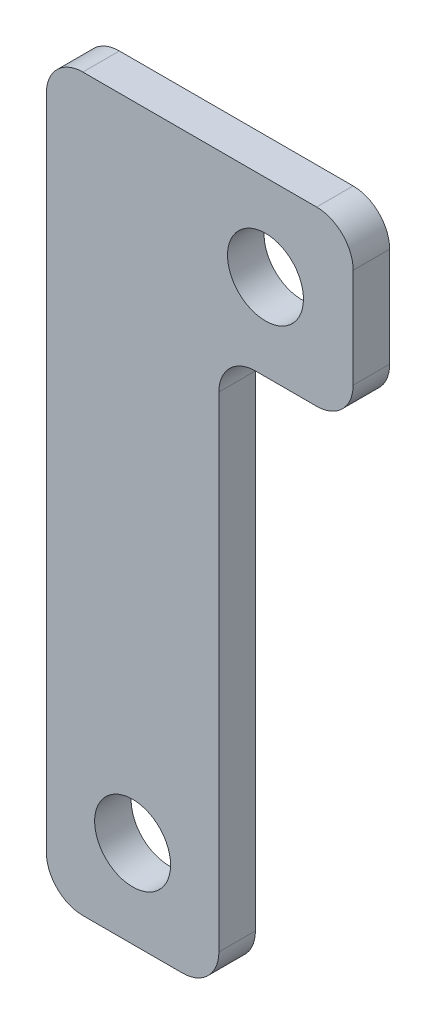
ISO-10303-21;
HEADER;
FILE_DESCRIPTION(('STEP AP214'),'2;1');
FILE_NAME('part.step','',(''),(''),'','','');
FILE_SCHEMA(('AUTOMOTIVE_DESIGN { 1 0 10303 214 1 1 1 1 }'));
ENDSEC;
DATA;
#1=APPLICATION_CONTEXT('core data for automotive mechanical design processes');
#2=APPLICATION_PROTOCOL_DEFINITION('international standard','automotive_design',2000,#1);
#3=PRODUCT_CONTEXT('',#1,'mechanical');
#4=PRODUCT('Part','Part','',(#3));
#5=PRODUCT_RELATED_PRODUCT_CATEGORY('part','',(#4));
#6=PRODUCT_DEFINITION_FORMATION('','',#4);
#7=PRODUCT_DEFINITION_CONTEXT('part definition',#1,'design');
#8=PRODUCT_DEFINITION('design','',#6,#7);
#9=PRODUCT_DEFINITION_SHAPE('','',#8);
#10=(LENGTH_UNIT() NAMED_UNIT(*) SI_UNIT(.MILLI.,.METRE.));
#11=(NAMED_UNIT(*) PLANE_ANGLE_UNIT() SI_UNIT($,.RADIAN.));
#12=(NAMED_UNIT(*) SI_UNIT($,.STERADIAN.) SOLID_ANGLE_UNIT());
#13=UNCERTAINTY_MEASURE_WITH_UNIT(LENGTH_MEASURE(1.E-05),#10,'distance_accuracy_value','');
#14=(GEOMETRIC_REPRESENTATION_CONTEXT(3) GLOBAL_UNCERTAINTY_ASSIGNED_CONTEXT((#13)) GLOBAL_UNIT_ASSIGNED_CONTEXT((#10,
#11,#12)) REPRESENTATION_CONTEXT('',''));
#15=CARTESIAN_POINT('',(0.,0.,0.));
#16=DIRECTION('',(0.,0.,1.));
#17=DIRECTION('',(1.,0.,0.));
#18=AXIS2_PLACEMENT_3D('',#15,#16,#17);
#19=CARTESIAN_POINT('',(-133.395921324416,118.528527902483,3.175));
#20=DIRECTION('',(0.,1.,0.));
#21=DIRECTION('',(0.,0.,1.));
#22=AXIS2_PLACEMENT_3D('',#19,#20,#21);
#23=PLANE('',#22);
#24=DIRECTION('',(1.,0.,0.));
#25=VECTOR('',#24,1.);
#26=CARTESIAN_POINT('',(-145.065921324416,118.528527902483,3.175));
#27=LINE('',#26,#25);
#28=CARTESIAN_POINT('',(-141.890921324416,118.528527902483,3.175));
#29=VERTEX_POINT('',#28);
#30=CARTESIAN_POINT('',(-136.570921324417,118.528527902483,3.175));
#31=VERTEX_POINT('',#30);
#32=EDGE_CURVE('E153',#29,#31,#27,.T.);
#33=ORIENTED_EDGE('',*,*,#32,.F.);
#34=DIRECTION('',(0.,0.,-1.));
#35=VECTOR('',#34,1.);
#36=CARTESIAN_POINT('',(-141.890921324416,118.528527902483,0.));
#37=LINE('',#36,#35);
#38=CARTESIAN_POINT('',(-141.890921324416,118.528527902483,0.));
#39=VERTEX_POINT('',#38);
#40=EDGE_CURVE('E193',#29,#39,#37,.T.);
#41=ORIENTED_EDGE('',*,*,#40,.T.);
#42=DIRECTION('',(1.,0.,0.));
#43=VECTOR('',#42,1.);
#44=CARTESIAN_POINT('',(-133.395921324416,118.528527902483,0.));
#45=LINE('',#44,#43);
#46=CARTESIAN_POINT('',(-136.570921324417,118.528527902483,0.));
#47=VERTEX_POINT('',#46);
#48=EDGE_CURVE('E214',#39,#47,#45,.T.);
#49=ORIENTED_EDGE('',*,*,#48,.T.);
#50=DIRECTION('',(0.,0.,-1.));
#51=VECTOR('',#50,1.);
#52=CARTESIAN_POINT('',(-136.570921324417,118.528527902483,3.175));
#53=LINE('',#52,#51);
#54=EDGE_CURVE('E191',#47,#31,#53,.F.);
#55=ORIENTED_EDGE('',*,*,#54,.T.);
#56=EDGE_LOOP('',(#33,#41,#49,#55));
#57=FACE_BOUND('',#56,.T.);
#58=ADVANCED_FACE('F37',(#57),#23,.F.);
#59=CARTESIAN_POINT('',(-133.395921324416,133.528527902483,3.175));
#60=DIRECTION('',(-1.,0.,0.));
#61=DIRECTION('',(0.,0.,1.));
#62=AXIS2_PLACEMENT_3D('',#59,#60,#61);
#63=PLANE('',#62);
#64=DIRECTION('',(0.,1.,0.));
#65=VECTOR('',#64,1.);
#66=CARTESIAN_POINT('',(-133.395921324416,133.528527902483,3.175));
#67=LINE('',#66,#65);
#68=CARTESIAN_POINT('',(-133.395921324416,121.703527902483,3.175));
#69=VERTEX_POINT('',#68);
#70=CARTESIAN_POINT('',(-133.395921324416,130.353527902483,3.175));
#71=VERTEX_POINT('',#70);
#72=EDGE_CURVE('E157',#69,#71,#67,.T.);
#73=ORIENTED_EDGE('',*,*,#72,.F.);
#74=DIRECTION('',(0.,0.,-1.));
#75=VECTOR('',#74,1.);
#76=CARTESIAN_POINT('',(-133.395921324416,121.703527902483,3.175));
#77=LINE('',#76,#75);
#78=CARTESIAN_POINT('',(-133.395921324416,121.703527902483,0.));
#79=VERTEX_POINT('',#78);
#80=EDGE_CURVE('E198',#69,#79,#77,.T.);
#81=ORIENTED_EDGE('',*,*,#80,.T.);
#82=DIRECTION('',(0.,1.,0.));
#83=VECTOR('',#82,1.);
#84=CARTESIAN_POINT('',(-133.395921324416,133.528527902483,0.));
#85=LINE('',#84,#83);
#86=CARTESIAN_POINT('',(-133.395921324416,130.353527902483,0.));
#87=VERTEX_POINT('',#86);
#88=EDGE_CURVE('E206',#79,#87,#85,.T.);
#89=ORIENTED_EDGE('',*,*,#88,.T.);
#90=DIRECTION('',(0.,0.,-1.));
#91=VECTOR('',#90,1.);
#92=CARTESIAN_POINT('',(-133.395921324416,130.353527902483,3.175));
#93=LINE('',#92,#91);
#94=EDGE_CURVE('E196',#87,#71,#93,.F.);
#95=ORIENTED_EDGE('',*,*,#94,.T.);
#96=EDGE_LOOP('',(#73,#81,#89,#95));
#97=FACE_BOUND('',#96,.T.);
#98=ADVANCED_FACE('F205',(#97),#63,.F.);
#99=CARTESIAN_POINT('',(-141.015921324416,133.528527902483,3.175));
#100=DIRECTION('',(0.,-1.,0.));
#101=DIRECTION('',(0.,0.,-1.));
#102=AXIS2_PLACEMENT_3D('',#99,#100,#101);
#103=PLANE('',#102);
#104=DIRECTION('',(-1.,0.,0.));
#105=VECTOR('',#104,1.);
#106=CARTESIAN_POINT('',(-141.015921324416,133.528527902483,0.));
#107=LINE('',#106,#105);
#108=CARTESIAN_POINT('',(-136.570921324417,133.528527902483,0.));
#109=VERTEX_POINT('',#108);
#110=CARTESIAN_POINT('',(-156.890921324416,133.528527902483,0.));
#111=VERTEX_POINT('',#110);
#112=EDGE_CURVE('E213',#109,#111,#107,.T.);
#113=ORIENTED_EDGE('',*,*,#112,.T.);
#114=DIRECTION('',(0.,0.,-1.));
#115=VECTOR('',#114,1.);
#116=CARTESIAN_POINT('',(-156.890921324416,133.528527902483,3.175));
#117=LINE('',#116,#115);
#118=CARTESIAN_POINT('',(-156.890921324416,133.528527902483,3.175));
#119=VERTEX_POINT('',#118);
#120=EDGE_CURVE('E189',#111,#119,#117,.F.);
#121=ORIENTED_EDGE('',*,*,#120,.T.);
#122=DIRECTION('',(-1.,0.,0.));
#123=VECTOR('',#122,1.);
#124=CARTESIAN_POINT('',(-141.015921324416,133.528527902483,3.175));
#125=LINE('',#124,#123);
#126=CARTESIAN_POINT('',(-136.570921324417,133.528527902483,3.175));
#127=VERTEX_POINT('',#126);
#128=EDGE_CURVE('E236',#127,#119,#125,.T.);
#129=ORIENTED_EDGE('',*,*,#128,.F.);
#130=DIRECTION('',(0.,0.,-1.));
#131=VECTOR('',#130,1.);
#132=CARTESIAN_POINT('',(-136.570921324417,133.528527902483,3.175));
#133=LINE('',#132,#131);
#134=EDGE_CURVE('E186',#127,#109,#133,.T.);
#135=ORIENTED_EDGE('',*,*,#134,.T.);
#136=EDGE_LOOP('',(#113,#121,#129,#135));
#137=FACE_BOUND('',#136,.T.);
#138=ADVANCED_FACE('F279',(#137),#103,.F.);
#139=CARTESIAN_POINT('',(-160.065921324417,133.528527902483,3.175));
#140=DIRECTION('',(1.,0.,0.));
#141=DIRECTION('',(0.,0.,-1.));
#142=AXIS2_PLACEMENT_3D('',#139,#140,#141);
#143=PLANE('',#142);
#144=DIRECTION('',(0.,-1.,0.));
#145=VECTOR('',#144,1.);
#146=CARTESIAN_POINT('',(-160.065921324417,133.528527902483,0.));
#147=LINE('',#146,#145);
#148=CARTESIAN_POINT('',(-160.065921324417,130.353527902483,0.));
#149=VERTEX_POINT('',#148);
#150=CARTESIAN_POINT('',(-160.065921324417,73.2035279024834,0.));
#151=VERTEX_POINT('',#150);
#152=EDGE_CURVE('E159',#149,#151,#147,.T.);
#153=ORIENTED_EDGE('',*,*,#152,.T.);
#154=DIRECTION('',(0.,0.,-1.));
#155=VECTOR('',#154,1.);
#156=CARTESIAN_POINT('',(-160.065921324417,73.2035279024834,3.175));
#157=LINE('',#156,#155);
#158=CARTESIAN_POINT('',(-160.065921324417,73.2035279024834,3.175));
#159=VERTEX_POINT('',#158);
#160=EDGE_CURVE('E52',#151,#159,#157,.F.);
#161=ORIENTED_EDGE('',*,*,#160,.T.);
#162=DIRECTION('',(0.,-1.,0.));
#163=VECTOR('',#162,1.);
#164=CARTESIAN_POINT('',(-160.065921324417,133.528527902483,3.175));
#165=LINE('',#164,#163);
#166=CARTESIAN_POINT('',(-160.065921324417,130.353527902483,3.175));
#167=VERTEX_POINT('',#166);
#168=EDGE_CURVE('E232',#167,#159,#165,.T.);
#169=ORIENTED_EDGE('',*,*,#168,.F.);
#170=DIRECTION('',(0.,0.,-1.));
#171=VECTOR('',#170,1.);
#172=CARTESIAN_POINT('',(-160.065921324417,130.353527902483,3.175));
#173=LINE('',#172,#171);
#174=EDGE_CURVE('E182',#167,#149,#173,.T.);
#175=ORIENTED_EDGE('',*,*,#174,.T.);
#176=EDGE_LOOP('',(#153,#161,#169,#175));
#177=FACE_BOUND('',#176,.T.);
#178=ADVANCED_FACE('F222',(#177),#143,.F.);
#179=CARTESIAN_POINT('',(-160.065921324417,70.0285279024834,3.175));
#180=DIRECTION('',(0.,1.,0.));
#181=DIRECTION('',(0.,0.,1.));
#182=AXIS2_PLACEMENT_3D('',#179,#180,#181);
#183=PLANE('',#182);
#184=DIRECTION('',(1.,0.,0.));
#185=VECTOR('',#184,1.);
#186=CARTESIAN_POINT('',(-160.065921324417,70.0285279024834,0.));
#187=LINE('',#186,#185);
#188=CARTESIAN_POINT('',(-156.890921324416,70.0285279024834,0.));
#189=VERTEX_POINT('',#188);
#190=CARTESIAN_POINT('',(-148.240921324416,70.0285279024834,0.));
#191=VERTEX_POINT('',#190);
#192=EDGE_CURVE('E154',#189,#191,#187,.T.);
#193=ORIENTED_EDGE('',*,*,#192,.T.);
#194=DIRECTION('',(0.,0.,-1.));
#195=VECTOR('',#194,1.);
#196=CARTESIAN_POINT('',(-148.240921324416,70.0285279024834,3.175));
#197=LINE('',#196,#195);
#198=CARTESIAN_POINT('',(-148.240921324416,70.0285279024834,3.175));
#199=VERTEX_POINT('',#198);
#200=EDGE_CURVE('E132',#191,#199,#197,.F.);
#201=ORIENTED_EDGE('',*,*,#200,.T.);
#202=DIRECTION('',(1.,0.,0.));
#203=VECTOR('',#202,1.);
#204=CARTESIAN_POINT('',(-160.065921324417,70.0285279024834,3.175));
#205=LINE('',#204,#203);
#206=CARTESIAN_POINT('',(-156.890921324416,70.0285279024834,3.175));
#207=VERTEX_POINT('',#206);
#208=EDGE_CURVE('E231',#207,#199,#205,.T.);
#209=ORIENTED_EDGE('',*,*,#208,.F.);
#210=DIRECTION('',(0.,0.,-1.));
#211=VECTOR('',#210,1.);
#212=CARTESIAN_POINT('',(-156.890921324416,70.0285279024834,3.175));
#213=LINE('',#212,#211);
#214=EDGE_CURVE('E137',#207,#189,#213,.T.);
#215=ORIENTED_EDGE('',*,*,#214,.T.);
#216=EDGE_LOOP('',(#193,#201,#209,#215));
#217=FACE_BOUND('',#216,.T.);
#218=ADVANCED_FACE('F234',(#217),#183,.F.);
#219=CARTESIAN_POINT('',(-145.065921324416,70.0285279024834,3.175));
#220=DIRECTION('',(-1.,0.,0.));
#221=DIRECTION('',(0.,0.,1.));
#222=AXIS2_PLACEMENT_3D('',#219,#220,#221);
#223=PLANE('',#222);
#224=DIRECTION('',(0.,1.,0.));
#225=VECTOR('',#224,1.);
#226=CARTESIAN_POINT('',(-145.065921324416,70.0285279024834,3.175));
#227=LINE('',#226,#225);
#228=CARTESIAN_POINT('',(-145.065921324416,73.2035279024834,3.175));
#229=VERTEX_POINT('',#228);
#230=CARTESIAN_POINT('',(-145.065921324416,115.353527902483,3.175));
#231=VERTEX_POINT('',#230);
#232=EDGE_CURVE('E147',#229,#231,#227,.T.);
#233=ORIENTED_EDGE('',*,*,#232,.F.);
#234=DIRECTION('',(0.,0.,-1.));
#235=VECTOR('',#234,1.);
#236=CARTESIAN_POINT('',(-145.065921324416,73.2035279024834,3.175));
#237=LINE('',#236,#235);
#238=CARTESIAN_POINT('',(-145.065921324416,73.2035279024834,0.));
#239=VERTEX_POINT('',#238);
#240=EDGE_CURVE('E131',#229,#239,#237,.T.);
#241=ORIENTED_EDGE('',*,*,#240,.T.);
#242=DIRECTION('',(0.,1.,0.));
#243=VECTOR('',#242,1.);
#244=CARTESIAN_POINT('',(-145.065921324416,70.0285279024834,0.));
#245=LINE('',#244,#243);
#246=CARTESIAN_POINT('',(-145.065921324416,115.353527902483,0.));
#247=VERTEX_POINT('',#246);
#248=EDGE_CURVE('E144',#239,#247,#245,.T.);
#249=ORIENTED_EDGE('',*,*,#248,.T.);
#250=DIRECTION('',(0.,0.,-1.));
#251=VECTOR('',#250,1.);
#252=CARTESIAN_POINT('',(-145.065921324416,115.353527902483,3.175));
#253=LINE('',#252,#251);
#254=EDGE_CURVE('E149',#247,#231,#253,.F.);
#255=ORIENTED_EDGE('',*,*,#254,.T.);
#256=EDGE_LOOP('',(#233,#241,#249,#255));
#257=FACE_BOUND('',#256,.T.);
#258=ADVANCED_FACE('F143',(#257),#223,.F.);
#259=CARTESIAN_POINT('',(0.,0.,3.175));
#260=DIRECTION('',(0.,0.,-1.));
#261=DIRECTION('',(-1.,0.,0.));
#262=AXIS2_PLACEMENT_3D('',#259,#260,#261);
#263=PLANE('',#262);
#264=CARTESIAN_POINT('',(-141.015921324415,126.028527902453,3.175));
#265=DIRECTION('',(0.,0.,1.));
#266=DIRECTION('',(1.,0.,0.));
#267=AXIS2_PLACEMENT_3D('',#264,#265,#266);
#268=CIRCLE('',#267,3.3);
#269=CARTESIAN_POINT('',(-137.715921324415,126.028527902453,3.175));
#270=VERTEX_POINT('',#269);
#271=EDGE_CURVE('E249',#270,#270,#268,.T.);
#272=ORIENTED_EDGE('',*,*,#271,.F.);
#273=EDGE_LOOP('',(#272));
#274=FACE_BOUND('',#273,.T.);
#275=CARTESIAN_POINT('',(-152.565921324416,77.6485279024834,3.175));
#276=DIRECTION('',(0.,0.,1.));
#277=DIRECTION('',(1.,0.,0.));
#278=AXIS2_PLACEMENT_3D('',#275,#276,#277);
#279=CIRCLE('',#278,3.3);
#280=CARTESIAN_POINT('',(-149.265921324416,77.6485279024834,3.175));
#281=VERTEX_POINT('',#280);
#282=EDGE_CURVE('E243',#281,#281,#279,.T.);
#283=ORIENTED_EDGE('',*,*,#282,.F.);
#284=EDGE_LOOP('',(#283));
#285=FACE_BOUND('',#284,.T.);
#286=ORIENTED_EDGE('',*,*,#208,.T.);
#287=CARTESIAN_POINT('',(-148.240921324416,73.2035279024834,3.175));
#288=DIRECTION('',(0.,0.,-1.));
#289=DIRECTION('',(-1.,0.,0.));
#290=AXIS2_PLACEMENT_3D('',#287,#288,#289);
#291=CIRCLE('',#290,3.175);
#292=EDGE_CURVE('E180',#199,#229,#291,.F.);
#293=ORIENTED_EDGE('',*,*,#292,.T.);
#294=ORIENTED_EDGE('',*,*,#232,.T.);
#295=CARTESIAN_POINT('',(-141.890921324416,115.353527902483,3.175));
#296=DIRECTION('',(0.,0.,-1.));
#297=DIRECTION('',(-1.,0.,0.));
#298=AXIS2_PLACEMENT_3D('',#295,#296,#297);
#299=CIRCLE('',#298,3.175);
#300=EDGE_CURVE('E11',#231,#29,#299,.T.);
#301=ORIENTED_EDGE('',*,*,#300,.T.);
#302=ORIENTED_EDGE('',*,*,#32,.T.);
#303=CARTESIAN_POINT('',(-136.570921324417,121.703527902483,3.175));
#304=DIRECTION('',(0.,0.,-1.));
#305=DIRECTION('',(-1.,0.,0.));
#306=AXIS2_PLACEMENT_3D('',#303,#304,#305);
#307=CIRCLE('',#306,3.175);
#308=EDGE_CURVE('E175',#31,#69,#307,.F.);
#309=ORIENTED_EDGE('',*,*,#308,.T.);
#310=ORIENTED_EDGE('',*,*,#72,.T.);
#311=CARTESIAN_POINT('',(-136.570921324417,130.353527902483,3.175));
#312=DIRECTION('',(0.,0.,-1.));
#313=DIRECTION('',(-1.,0.,0.));
#314=AXIS2_PLACEMENT_3D('',#311,#312,#313);
#315=CIRCLE('',#314,3.175);
#316=EDGE_CURVE('E173',#71,#127,#315,.F.);
#317=ORIENTED_EDGE('',*,*,#316,.T.);
#318=ORIENTED_EDGE('',*,*,#128,.T.);
#319=CARTESIAN_POINT('',(-156.890921324416,130.353527902483,3.175));
#320=DIRECTION('',(0.,0.,-1.));
#321=DIRECTION('',(-1.,0.,0.));
#322=AXIS2_PLACEMENT_3D('',#319,#320,#321);
#323=CIRCLE('',#322,3.175);
#324=EDGE_CURVE('E59',#119,#167,#323,.F.);
#325=ORIENTED_EDGE('',*,*,#324,.T.);
#326=ORIENTED_EDGE('',*,*,#168,.T.);
#327=CARTESIAN_POINT('',(-156.890921324416,73.2035279024834,3.175));
#328=DIRECTION('',(0.,0.,-1.));
#329=DIRECTION('',(-1.,0.,0.));
#330=AXIS2_PLACEMENT_3D('',#327,#328,#329);
#331=CIRCLE('',#330,3.175);
#332=EDGE_CURVE('E178',#159,#207,#331,.F.);
#333=ORIENTED_EDGE('',*,*,#332,.T.);
#334=EDGE_LOOP('',(#286,#293,#294,#301,#302,#309,#310,#317,#318,#325,#326,#333));
#335=FACE_BOUND('',#334,.T.);
#336=ADVANCED_FACE('F230',(#274,#285,#335),#263,.F.);
#337=CARTESIAN_POINT('',(0.,0.,0.));
#338=DIRECTION('',(0.,0.,-1.));
#339=DIRECTION('',(-1.,0.,0.));
#340=AXIS2_PLACEMENT_3D('',#337,#338,#339);
#341=PLANE('',#340);
#342=CARTESIAN_POINT('',(-141.015921324415,126.028527902453,0.));
#343=DIRECTION('',(0.,0.,1.));
#344=DIRECTION('',(1.,0.,0.));
#345=AXIS2_PLACEMENT_3D('',#342,#343,#344);
#346=CIRCLE('',#345,3.3);
#347=CARTESIAN_POINT('',(-137.715921324415,126.028527902453,0.));
#348=VERTEX_POINT('',#347);
#349=EDGE_CURVE('E246',#348,#348,#346,.T.);
#350=ORIENTED_EDGE('',*,*,#349,.T.);
#351=EDGE_LOOP('',(#350));
#352=FACE_BOUND('',#351,.T.);
#353=CARTESIAN_POINT('',(-152.565921324416,77.6485279024834,0.));
#354=DIRECTION('',(0.,0.,1.));
#355=DIRECTION('',(1.,0.,0.));
#356=AXIS2_PLACEMENT_3D('',#353,#354,#355);
#357=CIRCLE('',#356,3.3);
#358=CARTESIAN_POINT('',(-149.265921324416,77.6485279024834,0.));
#359=VERTEX_POINT('',#358);
#360=EDGE_CURVE('E218',#359,#359,#357,.T.);
#361=ORIENTED_EDGE('',*,*,#360,.T.);
#362=EDGE_LOOP('',(#361));
#363=FACE_BOUND('',#362,.T.);
#364=ORIENTED_EDGE('',*,*,#248,.F.);
#365=CARTESIAN_POINT('',(-148.240921324416,73.2035279024834,0.));
#366=DIRECTION('',(0.,0.,-1.));
#367=DIRECTION('',(-1.,0.,0.));
#368=AXIS2_PLACEMENT_3D('',#365,#366,#367);
#369=CIRCLE('',#368,3.175);
#370=EDGE_CURVE('E127',#239,#191,#369,.T.);
#371=ORIENTED_EDGE('',*,*,#370,.T.);
#372=ORIENTED_EDGE('',*,*,#192,.F.);
#373=CARTESIAN_POINT('',(-156.890921324416,73.2035279024834,0.));
#374=DIRECTION('',(0.,0.,-1.));
#375=DIRECTION('',(-1.,0.,0.));
#376=AXIS2_PLACEMENT_3D('',#373,#374,#375);
#377=CIRCLE('',#376,3.175);
#378=EDGE_CURVE('E138',#189,#151,#377,.T.);
#379=ORIENTED_EDGE('',*,*,#378,.T.);
#380=ORIENTED_EDGE('',*,*,#152,.F.);
#381=CARTESIAN_POINT('',(-156.890921324416,130.353527902483,0.));
#382=DIRECTION('',(0.,0.,-1.));
#383=DIRECTION('',(-1.,0.,0.));
#384=AXIS2_PLACEMENT_3D('',#381,#382,#383);
#385=CIRCLE('',#384,3.175);
#386=EDGE_CURVE('E167',#149,#111,#385,.T.);
#387=ORIENTED_EDGE('',*,*,#386,.T.);
#388=ORIENTED_EDGE('',*,*,#112,.F.);
#389=CARTESIAN_POINT('',(-136.570921324417,130.353527902483,0.));
#390=DIRECTION('',(0.,0.,-1.));
#391=DIRECTION('',(-1.,0.,0.));
#392=AXIS2_PLACEMENT_3D('',#389,#390,#391);
#393=CIRCLE('',#392,3.175);
#394=EDGE_CURVE('E148',#109,#87,#393,.T.);
#395=ORIENTED_EDGE('',*,*,#394,.T.);
#396=ORIENTED_EDGE('',*,*,#88,.F.);
#397=CARTESIAN_POINT('',(-136.570921324417,121.703527902483,0.));
#398=DIRECTION('',(0.,0.,-1.));
#399=DIRECTION('',(-1.,0.,0.));
#400=AXIS2_PLACEMENT_3D('',#397,#398,#399);
#401=CIRCLE('',#400,3.175);
#402=EDGE_CURVE('E165',#79,#47,#401,.T.);
#403=ORIENTED_EDGE('',*,*,#402,.T.);
#404=ORIENTED_EDGE('',*,*,#48,.F.);
#405=CARTESIAN_POINT('',(-141.890921324416,115.353527902483,0.));
#406=DIRECTION('',(0.,0.,-1.));
#407=DIRECTION('',(-1.,0.,0.));
#408=AXIS2_PLACEMENT_3D('',#405,#406,#407);
#409=CIRCLE('',#408,3.175);
#410=EDGE_CURVE('E45',#39,#247,#409,.F.);
#411=ORIENTED_EDGE('',*,*,#410,.T.);
#412=EDGE_LOOP('',(#364,#371,#372,#379,#380,#387,#388,#395,#396,#403,#404,#411));
#413=FACE_BOUND('',#412,.T.);
#414=ADVANCED_FACE('F151',(#352,#363,#413),#341,.T.);
#415=CARTESIAN_POINT('',(-152.565921324416,77.6485279024834,3.175));
#416=DIRECTION('',(0.,0.,1.));
#417=DIRECTION('',(1.,0.,0.));
#418=AXIS2_PLACEMENT_3D('',#415,#416,#417);
#419=CYLINDRICAL_SURFACE('',#418,3.3);
#420=ORIENTED_EDGE('',*,*,#360,.F.);
#421=EDGE_LOOP('',(#420));
#422=FACE_BOUND('',#421,.T.);
#423=ORIENTED_EDGE('',*,*,#282,.T.);
#424=EDGE_LOOP('',(#423));
#425=FACE_BOUND('',#424,.T.);
#426=ADVANCED_FACE('F260',(#422,#425),#419,.F.);
#427=CARTESIAN_POINT('',(-141.015921324415,126.028527902453,3.175));
#428=DIRECTION('',(0.,0.,1.));
#429=DIRECTION('',(1.,0.,0.));
#430=AXIS2_PLACEMENT_3D('',#427,#428,#429);
#431=CYLINDRICAL_SURFACE('',#430,3.3);
#432=ORIENTED_EDGE('',*,*,#349,.F.);
#433=EDGE_LOOP('',(#432));
#434=FACE_BOUND('',#433,.T.);
#435=ORIENTED_EDGE('',*,*,#271,.T.);
#436=EDGE_LOOP('',(#435));
#437=FACE_BOUND('',#436,.T.);
#438=ADVANCED_FACE('F253',(#434,#437),#431,.F.);
#439=CARTESIAN_POINT('',(-148.240921324416,73.2035279024834,3.175));
#440=DIRECTION('',(0.,0.,-1.));
#441=DIRECTION('',(-1.,0.,0.));
#442=AXIS2_PLACEMENT_3D('',#439,#440,#441);
#443=CYLINDRICAL_SURFACE('',#442,3.175);
#444=ORIENTED_EDGE('',*,*,#292,.F.);
#445=ORIENTED_EDGE('',*,*,#200,.F.);
#446=ORIENTED_EDGE('',*,*,#370,.F.);
#447=ORIENTED_EDGE('',*,*,#240,.F.);
#448=EDGE_LOOP('',(#444,#445,#446,#447));
#449=FACE_BOUND('',#448,.T.);
#450=ADVANCED_FACE('F130',(#449),#443,.T.);
#451=CARTESIAN_POINT('',(-156.890921324416,73.2035279024834,3.175));
#452=DIRECTION('',(0.,0.,-1.));
#453=DIRECTION('',(-1.,0.,0.));
#454=AXIS2_PLACEMENT_3D('',#451,#452,#453);
#455=CYLINDRICAL_SURFACE('',#454,3.175);
#456=ORIENTED_EDGE('',*,*,#332,.F.);
#457=ORIENTED_EDGE('',*,*,#160,.F.);
#458=ORIENTED_EDGE('',*,*,#378,.F.);
#459=ORIENTED_EDGE('',*,*,#214,.F.);
#460=EDGE_LOOP('',(#456,#457,#458,#459));
#461=FACE_BOUND('',#460,.T.);
#462=ADVANCED_FACE('F226',(#461),#455,.T.);
#463=CARTESIAN_POINT('',(-156.890921324416,130.353527902483,3.175));
#464=DIRECTION('',(0.,0.,-1.));
#465=DIRECTION('',(-1.,0.,0.));
#466=AXIS2_PLACEMENT_3D('',#463,#464,#465);
#467=CYLINDRICAL_SURFACE('',#466,3.175);
#468=ORIENTED_EDGE('',*,*,#324,.F.);
#469=ORIENTED_EDGE('',*,*,#120,.F.);
#470=ORIENTED_EDGE('',*,*,#386,.F.);
#471=ORIENTED_EDGE('',*,*,#174,.F.);
#472=EDGE_LOOP('',(#468,#469,#470,#471));
#473=FACE_BOUND('',#472,.T.);
#474=ADVANCED_FACE('F288',(#473),#467,.T.);
#475=CARTESIAN_POINT('',(-141.890921324416,115.353527902483,3.175));
#476=DIRECTION('',(0.,0.,1.));
#477=DIRECTION('',(1.,0.,0.));
#478=AXIS2_PLACEMENT_3D('',#475,#476,#477);
#479=CYLINDRICAL_SURFACE('',#478,3.175);
#480=ORIENTED_EDGE('',*,*,#300,.F.);
#481=ORIENTED_EDGE('',*,*,#254,.F.);
#482=ORIENTED_EDGE('',*,*,#410,.F.);
#483=ORIENTED_EDGE('',*,*,#40,.F.);
#484=EDGE_LOOP('',(#480,#481,#482,#483));
#485=FACE_BOUND('',#484,.T.);
#486=ADVANCED_FACE('F291',(#485),#479,.F.);
#487=CARTESIAN_POINT('',(-136.570921324417,121.703527902483,3.175));
#488=DIRECTION('',(0.,0.,-1.));
#489=DIRECTION('',(-1.,0.,0.));
#490=AXIS2_PLACEMENT_3D('',#487,#488,#489);
#491=CYLINDRICAL_SURFACE('',#490,3.175);
#492=ORIENTED_EDGE('',*,*,#308,.F.);
#493=ORIENTED_EDGE('',*,*,#54,.F.);
#494=ORIENTED_EDGE('',*,*,#402,.F.);
#495=ORIENTED_EDGE('',*,*,#80,.F.);
#496=EDGE_LOOP('',(#492,#493,#494,#495));
#497=FACE_BOUND('',#496,.T.);
#498=ADVANCED_FACE('F294',(#497),#491,.T.);
#499=CARTESIAN_POINT('',(-136.570921324417,130.353527902483,3.175));
#500=DIRECTION('',(0.,0.,-1.));
#501=DIRECTION('',(-1.,0.,0.));
#502=AXIS2_PLACEMENT_3D('',#499,#500,#501);
#503=CYLINDRICAL_SURFACE('',#502,3.175);
#504=ORIENTED_EDGE('',*,*,#316,.F.);
#505=ORIENTED_EDGE('',*,*,#94,.F.);
#506=ORIENTED_EDGE('',*,*,#394,.F.);
#507=ORIENTED_EDGE('',*,*,#134,.F.);
#508=EDGE_LOOP('',(#504,#505,#506,#507));
#509=FACE_BOUND('',#508,.T.);
#510=ADVANCED_FACE('F39',(#509),#503,.T.);
#511=CLOSED_SHELL('',(#58,#98,#138,#178,#218,#258,#336,#414,#426,#438,#450,#462,#474,#486,#498,#510));
#512=MANIFOLD_SOLID_BREP('B2',#511);
#513=ADVANCED_BREP_SHAPE_REPRESENTATION('',(#18,#512),#14);
#514=SHAPE_DEFINITION_REPRESENTATION(#9,#513);
ENDSEC;
END-ISO-10303-21;
